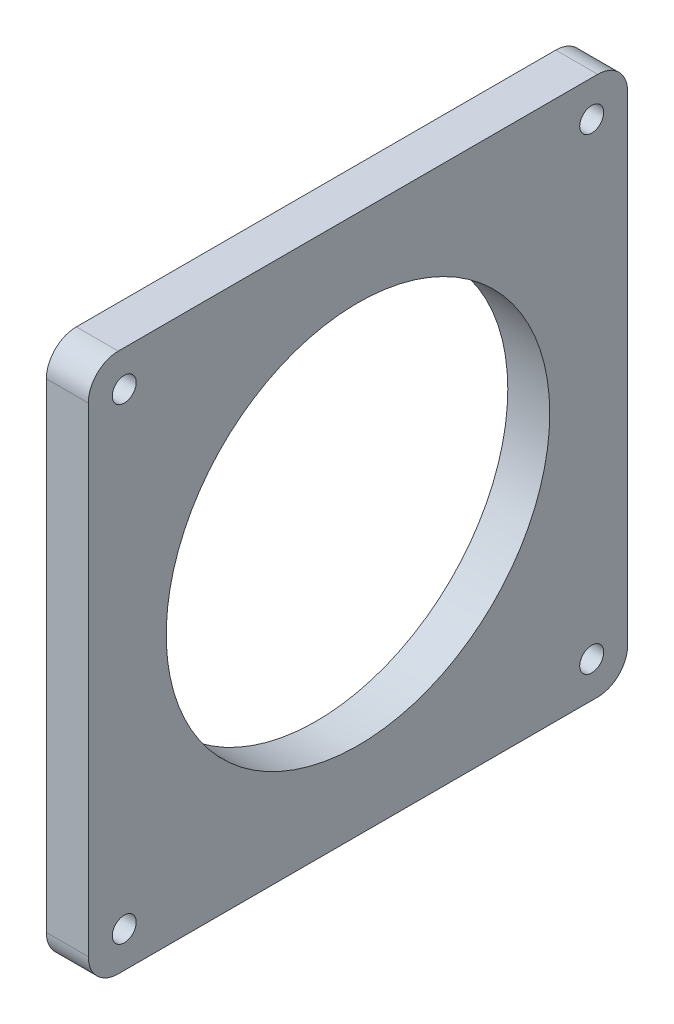
ISO-10303-21;
HEADER;
FILE_DESCRIPTION(('STEP AP214'),'2;1');
FILE_NAME('part.step','',(''),(''),'','','');
FILE_SCHEMA(('AUTOMOTIVE_DESIGN { 1 0 10303 214 1 1 1 1 }'));
ENDSEC;
DATA;
#1=APPLICATION_CONTEXT('core data for automotive mechanical design processes');
#2=APPLICATION_PROTOCOL_DEFINITION('international standard','automotive_design',2000,#1);
#3=PRODUCT_CONTEXT('',#1,'mechanical');
#4=PRODUCT('Part','Part','',(#3));
#5=PRODUCT_RELATED_PRODUCT_CATEGORY('part','',(#4));
#6=PRODUCT_DEFINITION_FORMATION('','',#4);
#7=PRODUCT_DEFINITION_CONTEXT('part definition',#1,'design');
#8=PRODUCT_DEFINITION('design','',#6,#7);
#9=PRODUCT_DEFINITION_SHAPE('','',#8);
#10=(LENGTH_UNIT() NAMED_UNIT(*) SI_UNIT(.MILLI.,.METRE.));
#11=(NAMED_UNIT(*) PLANE_ANGLE_UNIT() SI_UNIT($,.RADIAN.));
#12=(NAMED_UNIT(*) SI_UNIT($,.STERADIAN.) SOLID_ANGLE_UNIT());
#13=UNCERTAINTY_MEASURE_WITH_UNIT(LENGTH_MEASURE(1.E-05),#10,'distance_accuracy_value','');
#14=(GEOMETRIC_REPRESENTATION_CONTEXT(3) GLOBAL_UNCERTAINTY_ASSIGNED_CONTEXT((#13)) GLOBAL_UNIT_ASSIGNED_CONTEXT((#10,
#11,#12)) REPRESENTATION_CONTEXT('',''));
#15=CARTESIAN_POINT('',(0.,0.,0.));
#16=DIRECTION('',(0.,0.,1.));
#17=DIRECTION('',(1.,0.,0.));
#18=AXIS2_PLACEMENT_3D('',#15,#16,#17);
#19=CARTESIAN_POINT('',(7.,0.,0.));
#20=DIRECTION('',(1.,0.,0.));
#21=DIRECTION('',(0.,0.,-1.));
#22=AXIS2_PLACEMENT_3D('',#19,#20,#21);
#23=PLANE('',#22);
#24=CARTESIAN_POINT('',(7.,-39.,-39.));
#25=DIRECTION('',(-1.,0.,0.));
#26=DIRECTION('',(0.,0.,-1.));
#27=AXIS2_PLACEMENT_3D('',#24,#25,#26);
#28=CIRCLE('',#27,2.);
#29=CARTESIAN_POINT('',(7.,-39.,-41.));
#30=VERTEX_POINT('',#29);
#31=EDGE_CURVE('E612',#30,#30,#28,.T.);
#32=ORIENTED_EDGE('',*,*,#31,.T.);
#33=EDGE_LOOP('',(#32));
#34=FACE_BOUND('',#33,.T.);
#35=CARTESIAN_POINT('',(7.,-39.,39.));
#36=DIRECTION('',(-1.,0.,0.));
#37=DIRECTION('',(0.,0.,1.));
#38=AXIS2_PLACEMENT_3D('',#35,#36,#37);
#39=CIRCLE('',#38,2.);
#40=CARTESIAN_POINT('',(7.,-39.,41.));
#41=VERTEX_POINT('',#40);
#42=EDGE_CURVE('E625',#41,#41,#39,.T.);
#43=ORIENTED_EDGE('',*,*,#42,.T.);
#44=EDGE_LOOP('',(#43));
#45=FACE_BOUND('',#44,.T.);
#46=CARTESIAN_POINT('',(7.,39.,39.));
#47=DIRECTION('',(-1.,0.,0.));
#48=DIRECTION('',(0.,0.,-1.));
#49=AXIS2_PLACEMENT_3D('',#46,#47,#48);
#50=CIRCLE('',#49,2.);
#51=CARTESIAN_POINT('',(7.,39.,37.));
#52=VERTEX_POINT('',#51);
#53=EDGE_CURVE('E615',#52,#52,#50,.T.);
#54=ORIENTED_EDGE('',*,*,#53,.T.);
#55=EDGE_LOOP('',(#54));
#56=FACE_BOUND('',#55,.T.);
#57=CARTESIAN_POINT('',(7.,39.,-39.));
#58=DIRECTION('',(-1.,0.,0.));
#59=DIRECTION('',(0.,0.,1.));
#60=AXIS2_PLACEMENT_3D('',#57,#58,#59);
#61=CIRCLE('',#60,2.);
#62=CARTESIAN_POINT('',(7.,39.,-37.));
#63=VERTEX_POINT('',#62);
#64=EDGE_CURVE('E347',#63,#63,#61,.T.);
#65=ORIENTED_EDGE('',*,*,#64,.T.);
#66=EDGE_LOOP('',(#65));
#67=FACE_BOUND('',#66,.T.);
#68=DIRECTION('',(0.,1.,0.));
#69=VECTOR('',#68,1.);
#70=CARTESIAN_POINT('',(7.,0.,45.));
#71=LINE('',#70,#69);
#72=CARTESIAN_POINT('',(7.,-40.,45.));
#73=VERTEX_POINT('',#72);
#74=CARTESIAN_POINT('',(7.,40.,45.));
#75=VERTEX_POINT('',#74);
#76=EDGE_CURVE('E315',#73,#75,#71,.T.);
#77=ORIENTED_EDGE('',*,*,#76,.F.);
#78=CARTESIAN_POINT('',(7.00000000000001,-40.,40.));
#79=DIRECTION('',(1.,0.,0.));
#80=DIRECTION('',(0.,0.,-1.));
#81=AXIS2_PLACEMENT_3D('',#78,#79,#80);
#82=CIRCLE('',#81,5.);
#83=CARTESIAN_POINT('',(7.,-45.,40.));
#84=VERTEX_POINT('',#83);
#85=EDGE_CURVE('E295',#73,#84,#82,.T.);
#86=ORIENTED_EDGE('',*,*,#85,.T.);
#87=DIRECTION('',(0.,0.,-1.));
#88=VECTOR('',#87,1.);
#89=CARTESIAN_POINT('',(7.,-45.,0.));
#90=LINE('',#89,#88);
#91=CARTESIAN_POINT('',(7.,-45.,-40.));
#92=VERTEX_POINT('',#91);
#93=EDGE_CURVE('E324',#84,#92,#90,.T.);
#94=ORIENTED_EDGE('',*,*,#93,.T.);
#95=CARTESIAN_POINT('',(7.00000000000001,-40.,-40.));
#96=DIRECTION('',(1.,0.,0.));
#97=DIRECTION('',(0.,0.,-1.));
#98=AXIS2_PLACEMENT_3D('',#95,#96,#97);
#99=CIRCLE('',#98,5.);
#100=CARTESIAN_POINT('',(7.,-40.,-45.));
#101=VERTEX_POINT('',#100);
#102=EDGE_CURVE('E306',#92,#101,#99,.T.);
#103=ORIENTED_EDGE('',*,*,#102,.T.);
#104=DIRECTION('',(0.,1.,0.));
#105=VECTOR('',#104,1.);
#106=CARTESIAN_POINT('',(7.,0.,-45.));
#107=LINE('',#106,#105);
#108=CARTESIAN_POINT('',(7.,40.,-45.));
#109=VERTEX_POINT('',#108);
#110=EDGE_CURVE('E344',#101,#109,#107,.T.);
#111=ORIENTED_EDGE('',*,*,#110,.T.);
#112=CARTESIAN_POINT('',(7.00000000000001,40.,-40.));
#113=DIRECTION('',(1.,0.,0.));
#114=DIRECTION('',(0.,0.,-1.));
#115=AXIS2_PLACEMENT_3D('',#112,#113,#114);
#116=CIRCLE('',#115,5.);
#117=CARTESIAN_POINT('',(7.,45.,-40.));
#118=VERTEX_POINT('',#117);
#119=EDGE_CURVE('E365',#109,#118,#116,.T.);
#120=ORIENTED_EDGE('',*,*,#119,.T.);
#121=DIRECTION('',(0.,0.,-1.));
#122=VECTOR('',#121,1.);
#123=CARTESIAN_POINT('',(7.,45.,0.));
#124=LINE('',#123,#122);
#125=CARTESIAN_POINT('',(7.,45.,40.));
#126=VERTEX_POINT('',#125);
#127=EDGE_CURVE('E345',#126,#118,#124,.T.);
#128=ORIENTED_EDGE('',*,*,#127,.F.);
#129=CARTESIAN_POINT('',(7.00000000000001,40.,40.));
#130=DIRECTION('',(1.,0.,0.));
#131=DIRECTION('',(0.,0.,-1.));
#132=AXIS2_PLACEMENT_3D('',#129,#130,#131);
#133=CIRCLE('',#132,5.);
#134=EDGE_CURVE('E320',#126,#75,#133,.T.);
#135=ORIENTED_EDGE('',*,*,#134,.T.);
#136=EDGE_LOOP('',(#77,#86,#94,#103,#111,#120,#128,#135));
#137=FACE_BOUND('',#136,.T.);
#138=CARTESIAN_POINT('',(7.,0.,0.));
#139=DIRECTION('',(1.,0.,0.));
#140=DIRECTION('',(0.,0.,-1.));
#141=AXIS2_PLACEMENT_3D('',#138,#139,#140);
#142=CIRCLE('',#141,32.);
#143=CARTESIAN_POINT('',(7.,0.,-32.));
#144=VERTEX_POINT('',#143);
#145=EDGE_CURVE('E353',#144,#144,#142,.T.);
#146=ORIENTED_EDGE('',*,*,#145,.F.);
#147=EDGE_LOOP('',(#146));
#148=FACE_BOUND('',#147,.T.);
#149=ADVANCED_FACE('F227',(#34,#45,#56,#67,#137,#148),#23,.T.);
#150=CARTESIAN_POINT('',(0.,0.,0.));
#151=DIRECTION('',(1.,0.,0.));
#152=DIRECTION('',(0.,0.,-1.));
#153=AXIS2_PLACEMENT_3D('',#150,#151,#152);
#154=PLANE('',#153);
#155=CARTESIAN_POINT('',(0.,-39.,-39.));
#156=DIRECTION('',(-1.,0.,0.));
#157=DIRECTION('',(0.,0.,-1.));
#158=AXIS2_PLACEMENT_3D('',#155,#156,#157);
#159=CIRCLE('',#158,2.);
#160=CARTESIAN_POINT('',(0.,-39.,-41.));
#161=VERTEX_POINT('',#160);
#162=EDGE_CURVE('E616',#161,#161,#159,.T.);
#163=ORIENTED_EDGE('',*,*,#162,.F.);
#164=EDGE_LOOP('',(#163));
#165=FACE_BOUND('',#164,.T.);
#166=CARTESIAN_POINT('',(0.,-39.,39.));
#167=DIRECTION('',(-1.,0.,0.));
#168=DIRECTION('',(0.,0.,1.));
#169=AXIS2_PLACEMENT_3D('',#166,#167,#168);
#170=CIRCLE('',#169,2.);
#171=CARTESIAN_POINT('',(0.,-39.,41.));
#172=VERTEX_POINT('',#171);
#173=EDGE_CURVE('E626',#172,#172,#170,.T.);
#174=ORIENTED_EDGE('',*,*,#173,.F.);
#175=EDGE_LOOP('',(#174));
#176=FACE_BOUND('',#175,.T.);
#177=CARTESIAN_POINT('',(0.,39.,39.));
#178=DIRECTION('',(-1.,0.,0.));
#179=DIRECTION('',(0.,0.,-1.));
#180=AXIS2_PLACEMENT_3D('',#177,#178,#179);
#181=CIRCLE('',#180,2.);
#182=CARTESIAN_POINT('',(0.,39.,37.));
#183=VERTEX_POINT('',#182);
#184=EDGE_CURVE('E607',#183,#183,#181,.T.);
#185=ORIENTED_EDGE('',*,*,#184,.F.);
#186=EDGE_LOOP('',(#185));
#187=FACE_BOUND('',#186,.T.);
#188=CARTESIAN_POINT('',(0.,39.,-39.));
#189=DIRECTION('',(-1.,0.,0.));
#190=DIRECTION('',(0.,0.,1.));
#191=AXIS2_PLACEMENT_3D('',#188,#189,#190);
#192=CIRCLE('',#191,2.);
#193=CARTESIAN_POINT('',(0.,39.,-37.));
#194=VERTEX_POINT('',#193);
#195=EDGE_CURVE('E601',#194,#194,#192,.T.);
#196=ORIENTED_EDGE('',*,*,#195,.F.);
#197=EDGE_LOOP('',(#196));
#198=FACE_BOUND('',#197,.T.);
#199=DIRECTION('',(0.,0.,1.));
#200=VECTOR('',#199,1.);
#201=CARTESIAN_POINT('',(0.,-45.,0.));
#202=LINE('',#201,#200);
#203=CARTESIAN_POINT('',(0.,-45.,-40.));
#204=VERTEX_POINT('',#203);
#205=CARTESIAN_POINT('',(0.,-45.,40.));
#206=VERTEX_POINT('',#205);
#207=EDGE_CURVE('E334',#204,#206,#202,.T.);
#208=ORIENTED_EDGE('',*,*,#207,.T.);
#209=CARTESIAN_POINT('',(0.,-40.,40.));
#210=DIRECTION('',(1.,0.,0.));
#211=DIRECTION('',(0.,0.,-1.));
#212=AXIS2_PLACEMENT_3D('',#209,#210,#211);
#213=CIRCLE('',#212,5.);
#214=CARTESIAN_POINT('',(0.,-40.,45.));
#215=VERTEX_POINT('',#214);
#216=EDGE_CURVE('E379',#206,#215,#213,.F.);
#217=ORIENTED_EDGE('',*,*,#216,.T.);
#218=DIRECTION('',(0.,-1.,0.));
#219=VECTOR('',#218,1.);
#220=CARTESIAN_POINT('',(0.,0.,45.));
#221=LINE('',#220,#219);
#222=CARTESIAN_POINT('',(0.,40.,45.));
#223=VERTEX_POINT('',#222);
#224=EDGE_CURVE('E314',#223,#215,#221,.T.);
#225=ORIENTED_EDGE('',*,*,#224,.F.);
#226=CARTESIAN_POINT('',(0.,40.,40.));
#227=DIRECTION('',(1.,0.,0.));
#228=DIRECTION('',(0.,0.,-1.));
#229=AXIS2_PLACEMENT_3D('',#226,#227,#228);
#230=CIRCLE('',#229,5.);
#231=CARTESIAN_POINT('',(0.,45.,40.));
#232=VERTEX_POINT('',#231);
#233=EDGE_CURVE('E375',#223,#232,#230,.F.);
#234=ORIENTED_EDGE('',*,*,#233,.T.);
#235=DIRECTION('',(0.,0.,1.));
#236=VECTOR('',#235,1.);
#237=CARTESIAN_POINT('',(0.,45.,0.));
#238=LINE('',#237,#236);
#239=CARTESIAN_POINT('',(0.,45.,-40.));
#240=VERTEX_POINT('',#239);
#241=EDGE_CURVE('E328',#240,#232,#238,.T.);
#242=ORIENTED_EDGE('',*,*,#241,.F.);
#243=CARTESIAN_POINT('',(0.,40.,-40.));
#244=DIRECTION('',(1.,0.,0.));
#245=DIRECTION('',(0.,0.,-1.));
#246=AXIS2_PLACEMENT_3D('',#243,#244,#245);
#247=CIRCLE('',#246,5.);
#248=CARTESIAN_POINT('',(0.,40.,-45.));
#249=VERTEX_POINT('',#248);
#250=EDGE_CURVE('E249',#240,#249,#247,.F.);
#251=ORIENTED_EDGE('',*,*,#250,.T.);
#252=DIRECTION('',(0.,-1.,0.));
#253=VECTOR('',#252,1.);
#254=CARTESIAN_POINT('',(0.,0.,-45.));
#255=LINE('',#254,#253);
#256=CARTESIAN_POINT('',(0.,-40.,-45.));
#257=VERTEX_POINT('',#256);
#258=EDGE_CURVE('E321',#249,#257,#255,.T.);
#259=ORIENTED_EDGE('',*,*,#258,.T.);
#260=CARTESIAN_POINT('',(0.,-40.,-40.));
#261=DIRECTION('',(1.,0.,0.));
#262=DIRECTION('',(0.,0.,-1.));
#263=AXIS2_PLACEMENT_3D('',#260,#261,#262);
#264=CIRCLE('',#263,5.);
#265=EDGE_CURVE('E380',#257,#204,#264,.F.);
#266=ORIENTED_EDGE('',*,*,#265,.T.);
#267=EDGE_LOOP('',(#208,#217,#225,#234,#242,#251,#259,#266));
#268=FACE_BOUND('',#267,.T.);
#269=CARTESIAN_POINT('',(0.,0.,0.));
#270=DIRECTION('',(1.,0.,0.));
#271=DIRECTION('',(0.,0.,-1.));
#272=AXIS2_PLACEMENT_3D('',#269,#270,#271);
#273=CIRCLE('',#272,32.);
#274=CARTESIAN_POINT('',(0.,0.,-32.));
#275=VERTEX_POINT('',#274);
#276=EDGE_CURVE('E336',#275,#275,#273,.T.);
#277=ORIENTED_EDGE('',*,*,#276,.T.);
#278=EDGE_LOOP('',(#277));
#279=FACE_BOUND('',#278,.T.);
#280=ADVANCED_FACE('F402',(#165,#176,#187,#198,#268,#279),#154,.F.);
#281=CARTESIAN_POINT('',(7.,0.,0.));
#282=DIRECTION('',(-1.,0.,0.));
#283=DIRECTION('',(0.,0.,1.));
#284=AXIS2_PLACEMENT_3D('',#281,#282,#283);
#285=CYLINDRICAL_SURFACE('',#284,32.);
#286=ORIENTED_EDGE('',*,*,#145,.T.);
#287=EDGE_LOOP('',(#286));
#288=FACE_BOUND('',#287,.T.);
#289=ORIENTED_EDGE('',*,*,#276,.F.);
#290=EDGE_LOOP('',(#289));
#291=FACE_BOUND('',#290,.T.);
#292=ADVANCED_FACE('F423',(#288,#291),#285,.F.);
#293=CARTESIAN_POINT('',(-127.279220613579,0.,45.));
#294=DIRECTION('',(0.,0.,-1.));
#295=DIRECTION('',(-1.,0.,0.));
#296=AXIS2_PLACEMENT_3D('',#293,#294,#295);
#297=PLANE('',#296);
#298=ORIENTED_EDGE('',*,*,#224,.T.);
#299=DIRECTION('',(1.,0.,0.));
#300=VECTOR('',#299,1.);
#301=CARTESIAN_POINT('',(7.00000000000001,-40.,45.));
#302=LINE('',#301,#300);
#303=EDGE_CURVE('E296',#215,#73,#302,.T.);
#304=ORIENTED_EDGE('',*,*,#303,.T.);
#305=ORIENTED_EDGE('',*,*,#76,.T.);
#306=DIRECTION('',(1.,0.,0.));
#307=VECTOR('',#306,1.);
#308=CARTESIAN_POINT('',(-127.279220613579,40.,45.));
#309=LINE('',#308,#307);
#310=EDGE_CURVE('E319',#75,#223,#309,.F.);
#311=ORIENTED_EDGE('',*,*,#310,.T.);
#312=EDGE_LOOP('',(#298,#304,#305,#311));
#313=FACE_BOUND('',#312,.T.);
#314=ADVANCED_FACE('F311',(#313),#297,.F.);
#315=CARTESIAN_POINT('',(-127.279220613579,-45.,0.));
#316=DIRECTION('',(0.,-1.,0.));
#317=DIRECTION('',(0.,0.,-1.));
#318=AXIS2_PLACEMENT_3D('',#315,#316,#317);
#319=PLANE('',#318);
#320=ORIENTED_EDGE('',*,*,#93,.F.);
#321=DIRECTION('',(1.,0.,0.));
#322=VECTOR('',#321,1.);
#323=CARTESIAN_POINT('',(0.,-45.,40.));
#324=LINE('',#323,#322);
#325=EDGE_CURVE('E299',#84,#206,#324,.F.);
#326=ORIENTED_EDGE('',*,*,#325,.T.);
#327=ORIENTED_EDGE('',*,*,#207,.F.);
#328=DIRECTION('',(1.,0.,0.));
#329=VECTOR('',#328,1.);
#330=CARTESIAN_POINT('',(-127.279220613579,-45.,-40.));
#331=LINE('',#330,#329);
#332=EDGE_CURVE('E304',#204,#92,#331,.T.);
#333=ORIENTED_EDGE('',*,*,#332,.T.);
#334=EDGE_LOOP('',(#320,#326,#327,#333));
#335=FACE_BOUND('',#334,.T.);
#336=ADVANCED_FACE('F409',(#335),#319,.T.);
#337=CARTESIAN_POINT('',(-127.279220613579,0.,-45.));
#338=DIRECTION('',(0.,0.,-1.));
#339=DIRECTION('',(-1.,0.,0.));
#340=AXIS2_PLACEMENT_3D('',#337,#338,#339);
#341=PLANE('',#340);
#342=ORIENTED_EDGE('',*,*,#110,.F.);
#343=DIRECTION('',(1.,0.,0.));
#344=VECTOR('',#343,1.);
#345=CARTESIAN_POINT('',(-127.279220613579,-40.,-45.));
#346=LINE('',#345,#344);
#347=EDGE_CURVE('E243',#101,#257,#346,.F.);
#348=ORIENTED_EDGE('',*,*,#347,.T.);
#349=ORIENTED_EDGE('',*,*,#258,.F.);
#350=DIRECTION('',(1.,0.,0.));
#351=VECTOR('',#350,1.);
#352=CARTESIAN_POINT('',(7.00000000000001,40.,-45.));
#353=LINE('',#352,#351);
#354=EDGE_CURVE('E384',#249,#109,#353,.T.);
#355=ORIENTED_EDGE('',*,*,#354,.T.);
#356=EDGE_LOOP('',(#342,#348,#349,#355));
#357=FACE_BOUND('',#356,.T.);
#358=ADVANCED_FACE('F399',(#357),#341,.T.);
#359=CARTESIAN_POINT('',(-127.279220613579,45.,0.));
#360=DIRECTION('',(0.,-1.,0.));
#361=DIRECTION('',(0.,0.,-1.));
#362=AXIS2_PLACEMENT_3D('',#359,#360,#361);
#363=PLANE('',#362);
#364=ORIENTED_EDGE('',*,*,#127,.T.);
#365=DIRECTION('',(1.,0.,0.));
#366=VECTOR('',#365,1.);
#367=CARTESIAN_POINT('',(0.,45.,-40.));
#368=LINE('',#367,#366);
#369=EDGE_CURVE('E12',#118,#240,#368,.F.);
#370=ORIENTED_EDGE('',*,*,#369,.T.);
#371=ORIENTED_EDGE('',*,*,#241,.T.);
#372=DIRECTION('',(1.,0.,0.));
#373=VECTOR('',#372,1.);
#374=CARTESIAN_POINT('',(-127.279220613579,45.,40.));
#375=LINE('',#374,#373);
#376=EDGE_CURVE('E236',#232,#126,#375,.T.);
#377=ORIENTED_EDGE('',*,*,#376,.T.);
#378=EDGE_LOOP('',(#364,#370,#371,#377));
#379=FACE_BOUND('',#378,.T.);
#380=ADVANCED_FACE('F392',(#379),#363,.F.);
#381=CARTESIAN_POINT('',(7.,39.,-39.));
#382=DIRECTION('',(-1.,0.,0.));
#383=DIRECTION('',(0.,0.,1.));
#384=AXIS2_PLACEMENT_3D('',#381,#382,#383);
#385=CYLINDRICAL_SURFACE('',#384,2.);
#386=ORIENTED_EDGE('',*,*,#64,.F.);
#387=EDGE_LOOP('',(#386));
#388=FACE_BOUND('',#387,.T.);
#389=ORIENTED_EDGE('',*,*,#195,.T.);
#390=EDGE_LOOP('',(#389));
#391=FACE_BOUND('',#390,.T.);
#392=ADVANCED_FACE('F479',(#388,#391),#385,.F.);
#393=CARTESIAN_POINT('',(7.,39.,39.));
#394=DIRECTION('',(-1.,0.,0.));
#395=DIRECTION('',(0.,0.,1.));
#396=AXIS2_PLACEMENT_3D('',#393,#394,#395);
#397=CYLINDRICAL_SURFACE('',#396,2.);
#398=ORIENTED_EDGE('',*,*,#53,.F.);
#399=EDGE_LOOP('',(#398));
#400=FACE_BOUND('',#399,.T.);
#401=ORIENTED_EDGE('',*,*,#184,.T.);
#402=EDGE_LOOP('',(#401));
#403=FACE_BOUND('',#402,.T.);
#404=ADVANCED_FACE('F469',(#400,#403),#397,.F.);
#405=CARTESIAN_POINT('',(7.,-39.,39.));
#406=DIRECTION('',(-1.,0.,0.));
#407=DIRECTION('',(0.,0.,1.));
#408=AXIS2_PLACEMENT_3D('',#405,#406,#407);
#409=CYLINDRICAL_SURFACE('',#408,2.);
#410=ORIENTED_EDGE('',*,*,#42,.F.);
#411=EDGE_LOOP('',(#410));
#412=FACE_BOUND('',#411,.T.);
#413=ORIENTED_EDGE('',*,*,#173,.T.);
#414=EDGE_LOOP('',(#413));
#415=FACE_BOUND('',#414,.T.);
#416=ADVANCED_FACE('F460',(#412,#415),#409,.F.);
#417=CARTESIAN_POINT('',(7.,-39.,-39.));
#418=DIRECTION('',(-1.,0.,0.));
#419=DIRECTION('',(0.,0.,1.));
#420=AXIS2_PLACEMENT_3D('',#417,#418,#419);
#421=CYLINDRICAL_SURFACE('',#420,2.);
#422=ORIENTED_EDGE('',*,*,#31,.F.);
#423=EDGE_LOOP('',(#422));
#424=FACE_BOUND('',#423,.T.);
#425=ORIENTED_EDGE('',*,*,#162,.T.);
#426=EDGE_LOOP('',(#425));
#427=FACE_BOUND('',#426,.T.);
#428=ADVANCED_FACE('F431',(#424,#427),#421,.F.);
#429=CARTESIAN_POINT('',(-127.279220613579,-40.,40.));
#430=DIRECTION('',(-1.,0.,0.));
#431=DIRECTION('',(0.,0.,1.));
#432=AXIS2_PLACEMENT_3D('',#429,#430,#431);
#433=CYLINDRICAL_SURFACE('',#432,5.);
#434=ORIENTED_EDGE('',*,*,#216,.F.);
#435=ORIENTED_EDGE('',*,*,#325,.F.);
#436=ORIENTED_EDGE('',*,*,#85,.F.);
#437=ORIENTED_EDGE('',*,*,#303,.F.);
#438=EDGE_LOOP('',(#434,#435,#436,#437));
#439=FACE_BOUND('',#438,.T.);
#440=ADVANCED_FACE('F300',(#439),#433,.T.);
#441=CARTESIAN_POINT('',(-127.279220613579,-40.,-40.));
#442=DIRECTION('',(1.,0.,0.));
#443=DIRECTION('',(0.,0.,-1.));
#444=AXIS2_PLACEMENT_3D('',#441,#442,#443);
#445=CYLINDRICAL_SURFACE('',#444,5.);
#446=ORIENTED_EDGE('',*,*,#265,.F.);
#447=ORIENTED_EDGE('',*,*,#347,.F.);
#448=ORIENTED_EDGE('',*,*,#102,.F.);
#449=ORIENTED_EDGE('',*,*,#332,.F.);
#450=EDGE_LOOP('',(#446,#447,#448,#449));
#451=FACE_BOUND('',#450,.T.);
#452=ADVANCED_FACE('F407',(#451),#445,.T.);
#453=CARTESIAN_POINT('',(-127.279220613579,40.,-40.));
#454=DIRECTION('',(-1.,0.,0.));
#455=DIRECTION('',(0.,0.,1.));
#456=AXIS2_PLACEMENT_3D('',#453,#454,#455);
#457=CYLINDRICAL_SURFACE('',#456,5.);
#458=ORIENTED_EDGE('',*,*,#250,.F.);
#459=ORIENTED_EDGE('',*,*,#369,.F.);
#460=ORIENTED_EDGE('',*,*,#119,.F.);
#461=ORIENTED_EDGE('',*,*,#354,.F.);
#462=EDGE_LOOP('',(#458,#459,#460,#461));
#463=FACE_BOUND('',#462,.T.);
#464=ADVANCED_FACE('F396',(#463),#457,.T.);
#465=CARTESIAN_POINT('',(-127.279220613579,40.,40.));
#466=DIRECTION('',(1.,0.,0.));
#467=DIRECTION('',(0.,0.,-1.));
#468=AXIS2_PLACEMENT_3D('',#465,#466,#467);
#469=CYLINDRICAL_SURFACE('',#468,5.);
#470=ORIENTED_EDGE('',*,*,#233,.F.);
#471=ORIENTED_EDGE('',*,*,#310,.F.);
#472=ORIENTED_EDGE('',*,*,#134,.F.);
#473=ORIENTED_EDGE('',*,*,#376,.F.);
#474=EDGE_LOOP('',(#470,#471,#472,#473));
#475=FACE_BOUND('',#474,.T.);
#476=ADVANCED_FACE('F230',(#475),#469,.T.);
#477=CLOSED_SHELL('',(#149,#280,#292,#314,#336,#358,#380,#392,#404,#416,#428,#440,#452,#464,#476));
#478=MANIFOLD_SOLID_BREP('B2',#477);
#479=ADVANCED_BREP_SHAPE_REPRESENTATION('',(#18,#478),#14);
#480=SHAPE_DEFINITION_REPRESENTATION(#9,#479);
ENDSEC;
END-ISO-10303-21;
